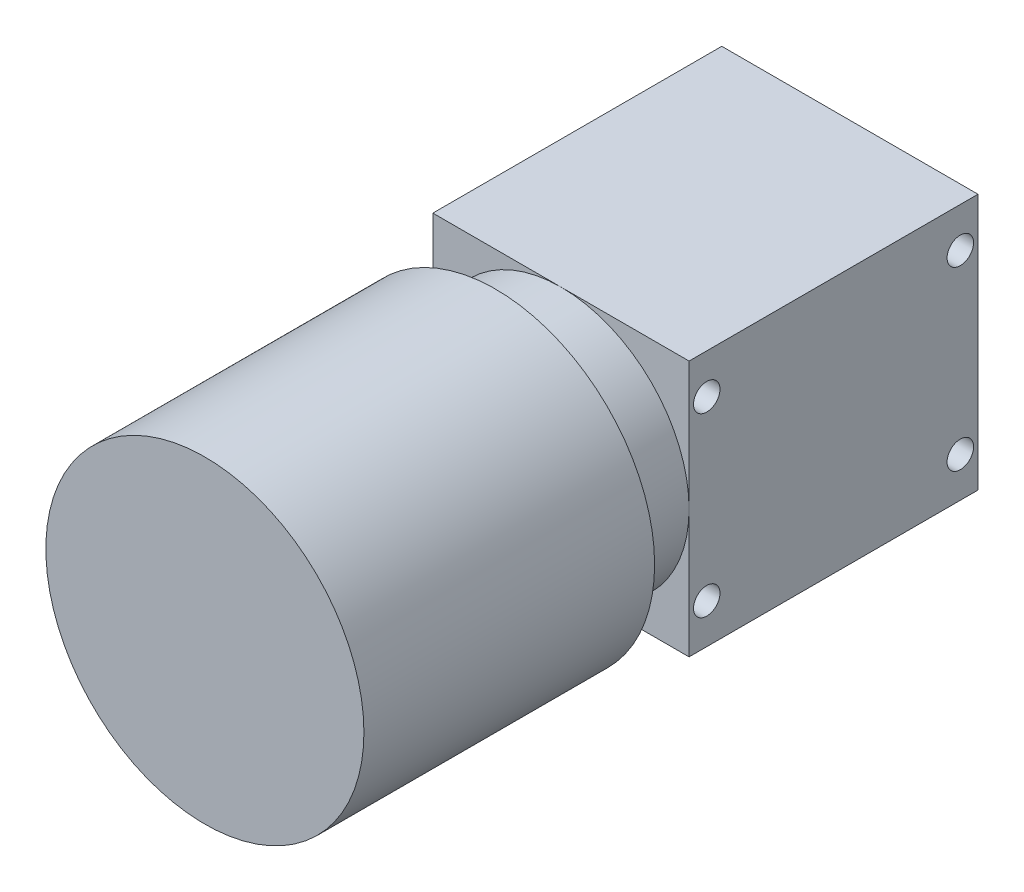
ISO-10303-21;
HEADER;
FILE_DESCRIPTION(('STEP AP214'),'2;1');
FILE_NAME('part.step','',(''),(''),'','','');
FILE_SCHEMA(('AUTOMOTIVE_DESIGN { 1 0 10303 214 1 1 1 1 }'));
ENDSEC;
DATA;
#1=APPLICATION_CONTEXT('core data for automotive mechanical design processes');
#2=APPLICATION_PROTOCOL_DEFINITION('international standard','automotive_design',2000,#1);
#3=PRODUCT_CONTEXT('',#1,'mechanical');
#4=PRODUCT('Part','Part','',(#3));
#5=PRODUCT_RELATED_PRODUCT_CATEGORY('part','',(#4));
#6=PRODUCT_DEFINITION_FORMATION('','',#4);
#7=PRODUCT_DEFINITION_CONTEXT('part definition',#1,'design');
#8=PRODUCT_DEFINITION('design','',#6,#7);
#9=PRODUCT_DEFINITION_SHAPE('','',#8);
#10=(LENGTH_UNIT() NAMED_UNIT(*) SI_UNIT(.MILLI.,.METRE.));
#11=(NAMED_UNIT(*) PLANE_ANGLE_UNIT() SI_UNIT($,.RADIAN.));
#12=(NAMED_UNIT(*) SI_UNIT($,.STERADIAN.) SOLID_ANGLE_UNIT());
#13=UNCERTAINTY_MEASURE_WITH_UNIT(LENGTH_MEASURE(1.E-05),#10,'distance_accuracy_value','');
#14=(GEOMETRIC_REPRESENTATION_CONTEXT(3) GLOBAL_UNCERTAINTY_ASSIGNED_CONTEXT((#13)) GLOBAL_UNIT_ASSIGNED_CONTEXT((#10,
#11,#12)) REPRESENTATION_CONTEXT('',''));
#15=CARTESIAN_POINT('',(0.,0.,0.));
#16=DIRECTION('',(0.,0.,1.));
#17=DIRECTION('',(1.,0.,0.));
#18=AXIS2_PLACEMENT_3D('',#15,#16,#17);
#19=CARTESIAN_POINT('',(0.,0.,32.7));
#20=DIRECTION('',(0.,0.,-1.));
#21=DIRECTION('',(-1.,0.,0.));
#22=AXIS2_PLACEMENT_3D('',#19,#20,#21);
#23=PLANE('',#22);
#24=CARTESIAN_POINT('',(0.,0.,32.7));
#25=DIRECTION('',(0.,0.,1.));
#26=DIRECTION('',(1.,0.,0.));
#27=AXIS2_PLACEMENT_3D('',#24,#25,#26);
#28=CIRCLE('',#27,14.5);
#29=CARTESIAN_POINT('',(14.5,0.,32.7));
#30=VERTEX_POINT('',#29);
#31=CARTESIAN_POINT('',(0.,14.5,32.7));
#32=VERTEX_POINT('',#31);
#33=EDGE_CURVE('E243',#30,#32,#28,.T.);
#34=ORIENTED_EDGE('',*,*,#33,.F.);
#35=DIRECTION('',(0.,1.,0.));
#36=VECTOR('',#35,1.);
#37=CARTESIAN_POINT('',(14.5,-14.5,32.7));
#38=LINE('',#37,#36);
#39=CARTESIAN_POINT('',(14.5,14.5,32.7));
#40=VERTEX_POINT('',#39);
#41=EDGE_CURVE('E294',#30,#40,#38,.T.);
#42=ORIENTED_EDGE('',*,*,#41,.T.);
#43=DIRECTION('',(-1.,0.,0.));
#44=VECTOR('',#43,1.);
#45=CARTESIAN_POINT('',(-14.5,14.5,32.7));
#46=LINE('',#45,#44);
#47=EDGE_CURVE('E305',#40,#32,#46,.T.);
#48=ORIENTED_EDGE('',*,*,#47,.T.);
#49=EDGE_LOOP('',(#34,#42,#48));
#50=FACE_BOUND('',#49,.T.);
#51=ADVANCED_FACE('F231',(#50),#23,.F.);
#52=CARTESIAN_POINT('',(-14.5,0.,32.7));
#53=VERTEX_POINT('',#52);
#54=EDGE_CURVE('E192',#32,#53,#28,.T.);
#55=ORIENTED_EDGE('',*,*,#54,.F.);
#56=CARTESIAN_POINT('',(-14.5,14.5,32.7));
#57=VERTEX_POINT('',#56);
#58=EDGE_CURVE('E293',#32,#57,#46,.T.);
#59=ORIENTED_EDGE('',*,*,#58,.T.);
#60=DIRECTION('',(0.,-1.,0.));
#61=VECTOR('',#60,1.);
#62=CARTESIAN_POINT('',(-14.5,-14.5,32.7));
#63=LINE('',#62,#61);
#64=EDGE_CURVE('E316',#57,#53,#63,.T.);
#65=ORIENTED_EDGE('',*,*,#64,.T.);
#66=EDGE_LOOP('',(#55,#59,#65));
#67=FACE_BOUND('',#66,.T.);
#68=ADVANCED_FACE('F349',(#67),#23,.F.);
#69=CARTESIAN_POINT('',(0.,-14.5,32.7));
#70=VERTEX_POINT('',#69);
#71=EDGE_CURVE('E241',#53,#70,#28,.T.);
#72=ORIENTED_EDGE('',*,*,#71,.F.);
#73=CARTESIAN_POINT('',(-14.5,-14.5,32.7));
#74=VERTEX_POINT('',#73);
#75=EDGE_CURVE('E315',#53,#74,#63,.T.);
#76=ORIENTED_EDGE('',*,*,#75,.T.);
#77=DIRECTION('',(1.,0.,0.));
#78=VECTOR('',#77,1.);
#79=CARTESIAN_POINT('',(-14.5,-14.5,32.7));
#80=LINE('',#79,#78);
#81=EDGE_CURVE('E319',#74,#70,#80,.T.);
#82=ORIENTED_EDGE('',*,*,#81,.T.);
#83=EDGE_LOOP('',(#72,#76,#82));
#84=FACE_BOUND('',#83,.T.);
#85=ADVANCED_FACE('F358',(#84),#23,.F.);
#86=CARTESIAN_POINT('',(14.5,-14.5,32.7));
#87=DIRECTION('',(-1.,0.,0.));
#88=DIRECTION('',(0.,0.,1.));
#89=AXIS2_PLACEMENT_3D('',#86,#87,#88);
#90=PLANE('',#89);
#91=CARTESIAN_POINT('',(14.5,10.,1.99999999999999));
#92=DIRECTION('',(-1.,0.,0.));
#93=DIRECTION('',(0.,0.,1.));
#94=AXIS2_PLACEMENT_3D('',#91,#92,#93);
#95=CIRCLE('',#94,1.5);
#96=CARTESIAN_POINT('',(14.5,10.,3.49999999999999));
#97=VERTEX_POINT('',#96);
#98=EDGE_CURVE('E553',#97,#97,#95,.T.);
#99=ORIENTED_EDGE('',*,*,#98,.T.);
#100=EDGE_LOOP('',(#99));
#101=FACE_BOUND('',#100,.T.);
#102=CARTESIAN_POINT('',(14.5,-10.,30.7));
#103=DIRECTION('',(-1.,0.,0.));
#104=DIRECTION('',(0.,0.,1.));
#105=AXIS2_PLACEMENT_3D('',#102,#103,#104);
#106=CIRCLE('',#105,1.5);
#107=CARTESIAN_POINT('',(14.5,-10.,32.2));
#108=VERTEX_POINT('',#107);
#109=EDGE_CURVE('E545',#108,#108,#106,.T.);
#110=ORIENTED_EDGE('',*,*,#109,.T.);
#111=EDGE_LOOP('',(#110));
#112=FACE_BOUND('',#111,.T.);
#113=CARTESIAN_POINT('',(14.5,-10.,1.99999999999999));
#114=DIRECTION('',(-1.,0.,0.));
#115=DIRECTION('',(0.,0.,1.));
#116=AXIS2_PLACEMENT_3D('',#113,#114,#115);
#117=CIRCLE('',#116,1.5);
#118=CARTESIAN_POINT('',(14.5,-10.,3.49999999999999));
#119=VERTEX_POINT('',#118);
#120=EDGE_CURVE('E542',#119,#119,#117,.T.);
#121=ORIENTED_EDGE('',*,*,#120,.T.);
#122=EDGE_LOOP('',(#121));
#123=FACE_BOUND('',#122,.T.);
#124=CARTESIAN_POINT('',(14.5,10.,30.7));
#125=DIRECTION('',(-1.,0.,0.));
#126=DIRECTION('',(0.,0.,1.));
#127=AXIS2_PLACEMENT_3D('',#124,#125,#126);
#128=CIRCLE('',#127,1.5);
#129=CARTESIAN_POINT('',(14.5,10.,32.2));
#130=VERTEX_POINT('',#129);
#131=EDGE_CURVE('E540',#130,#130,#128,.T.);
#132=ORIENTED_EDGE('',*,*,#131,.T.);
#133=EDGE_LOOP('',(#132));
#134=FACE_BOUND('',#133,.T.);
#135=DIRECTION('',(0.,1.,0.));
#136=VECTOR('',#135,1.);
#137=CARTESIAN_POINT('',(14.5,-14.5,0.));
#138=LINE('',#137,#136);
#139=CARTESIAN_POINT('',(14.5,-14.5,0.));
#140=VERTEX_POINT('',#139);
#141=CARTESIAN_POINT('',(14.5,14.5,0.));
#142=VERTEX_POINT('',#141);
#143=EDGE_CURVE('E322',#140,#142,#138,.T.);
#144=ORIENTED_EDGE('',*,*,#143,.T.);
#145=DIRECTION('',(0.,0.,-1.));
#146=VECTOR('',#145,1.);
#147=CARTESIAN_POINT('',(14.5,14.5,32.7));
#148=LINE('',#147,#146);
#149=EDGE_CURVE('E235',#40,#142,#148,.T.);
#150=ORIENTED_EDGE('',*,*,#149,.F.);
#151=ORIENTED_EDGE('',*,*,#41,.F.);
#152=CARTESIAN_POINT('',(14.5,-14.5,32.7));
#153=VERTEX_POINT('',#152);
#154=EDGE_CURVE('E286',#153,#30,#38,.T.);
#155=ORIENTED_EDGE('',*,*,#154,.F.);
#156=DIRECTION('',(0.,0.,-1.));
#157=VECTOR('',#156,1.);
#158=CARTESIAN_POINT('',(14.5,-14.5,32.7));
#159=LINE('',#158,#157);
#160=EDGE_CURVE('E321',#153,#140,#159,.T.);
#161=ORIENTED_EDGE('',*,*,#160,.T.);
#162=EDGE_LOOP('',(#144,#150,#151,#155,#161));
#163=FACE_BOUND('',#162,.T.);
#164=ADVANCED_FACE('F233',(#101,#112,#123,#134,#163),#90,.F.);
#165=CARTESIAN_POINT('',(-14.5,14.5,32.7));
#166=DIRECTION('',(0.,-1.,0.));
#167=DIRECTION('',(0.,0.,-1.));
#168=AXIS2_PLACEMENT_3D('',#165,#166,#167);
#169=PLANE('',#168);
#170=DIRECTION('',(-1.,0.,0.));
#171=VECTOR('',#170,1.);
#172=CARTESIAN_POINT('',(-14.5,14.5,0.));
#173=LINE('',#172,#171);
#174=CARTESIAN_POINT('',(-14.5,14.5,0.));
#175=VERTEX_POINT('',#174);
#176=EDGE_CURVE('E324',#142,#175,#173,.T.);
#177=ORIENTED_EDGE('',*,*,#176,.T.);
#178=DIRECTION('',(0.,0.,-1.));
#179=VECTOR('',#178,1.);
#180=CARTESIAN_POINT('',(-14.5,14.5,32.7));
#181=LINE('',#180,#179);
#182=EDGE_CURVE('E310',#57,#175,#181,.T.);
#183=ORIENTED_EDGE('',*,*,#182,.F.);
#184=ORIENTED_EDGE('',*,*,#58,.F.);
#185=ORIENTED_EDGE('',*,*,#47,.F.);
#186=ORIENTED_EDGE('',*,*,#149,.T.);
#187=EDGE_LOOP('',(#177,#183,#184,#185,#186));
#188=FACE_BOUND('',#187,.T.);
#189=ADVANCED_FACE('F350',(#188),#169,.F.);
#190=CARTESIAN_POINT('',(-14.5,-14.5,32.7));
#191=DIRECTION('',(1.,0.,0.));
#192=DIRECTION('',(0.,1.,0.));
#193=AXIS2_PLACEMENT_3D('',#190,#191,#192);
#194=PLANE('',#193);
#195=CARTESIAN_POINT('',(-14.5,10.,1.99999999999999));
#196=DIRECTION('',(-1.,0.,0.));
#197=DIRECTION('',(0.,-1.,0.));
#198=AXIS2_PLACEMENT_3D('',#195,#196,#197);
#199=CIRCLE('',#198,1.5);
#200=CARTESIAN_POINT('',(-14.5,8.5,1.99999999999999));
#201=VERTEX_POINT('',#200);
#202=EDGE_CURVE('E547',#201,#201,#199,.T.);
#203=ORIENTED_EDGE('',*,*,#202,.F.);
#204=EDGE_LOOP('',(#203));
#205=FACE_BOUND('',#204,.T.);
#206=CARTESIAN_POINT('',(-14.5,-10.,30.7));
#207=DIRECTION('',(-1.,0.,0.));
#208=DIRECTION('',(0.,-1.,0.));
#209=AXIS2_PLACEMENT_3D('',#206,#207,#208);
#210=CIRCLE('',#209,1.5);
#211=CARTESIAN_POINT('',(-14.5,-11.5,30.7));
#212=VERTEX_POINT('',#211);
#213=EDGE_CURVE('E564',#212,#212,#210,.T.);
#214=ORIENTED_EDGE('',*,*,#213,.F.);
#215=EDGE_LOOP('',(#214));
#216=FACE_BOUND('',#215,.T.);
#217=CARTESIAN_POINT('',(-14.5,-10.,1.99999999999999));
#218=DIRECTION('',(-1.,0.,0.));
#219=DIRECTION('',(0.,-1.,0.));
#220=AXIS2_PLACEMENT_3D('',#217,#218,#219);
#221=CIRCLE('',#220,1.5);
#222=CARTESIAN_POINT('',(-14.5,-11.5,1.99999999999999));
#223=VERTEX_POINT('',#222);
#224=EDGE_CURVE('E558',#223,#223,#221,.T.);
#225=ORIENTED_EDGE('',*,*,#224,.F.);
#226=EDGE_LOOP('',(#225));
#227=FACE_BOUND('',#226,.T.);
#228=CARTESIAN_POINT('',(-14.5,10.,30.7));
#229=DIRECTION('',(-1.,0.,0.));
#230=DIRECTION('',(0.,-1.,0.));
#231=AXIS2_PLACEMENT_3D('',#228,#229,#230);
#232=CIRCLE('',#231,1.5);
#233=CARTESIAN_POINT('',(-14.5,8.5,30.7));
#234=VERTEX_POINT('',#233);
#235=EDGE_CURVE('E537',#234,#234,#232,.T.);
#236=ORIENTED_EDGE('',*,*,#235,.F.);
#237=EDGE_LOOP('',(#236));
#238=FACE_BOUND('',#237,.T.);
#239=DIRECTION('',(0.,-1.,0.));
#240=VECTOR('',#239,1.);
#241=CARTESIAN_POINT('',(-14.5,-14.5,0.));
#242=LINE('',#241,#240);
#243=CARTESIAN_POINT('',(-14.5,-14.5,0.));
#244=VERTEX_POINT('',#243);
#245=EDGE_CURVE('E326',#175,#244,#242,.T.);
#246=ORIENTED_EDGE('',*,*,#245,.T.);
#247=DIRECTION('',(0.,0.,-1.));
#248=VECTOR('',#247,1.);
#249=CARTESIAN_POINT('',(-14.5,-14.5,32.7));
#250=LINE('',#249,#248);
#251=EDGE_CURVE('E330',#74,#244,#250,.T.);
#252=ORIENTED_EDGE('',*,*,#251,.F.);
#253=ORIENTED_EDGE('',*,*,#75,.F.);
#254=ORIENTED_EDGE('',*,*,#64,.F.);
#255=ORIENTED_EDGE('',*,*,#182,.T.);
#256=EDGE_LOOP('',(#246,#252,#253,#254,#255));
#257=FACE_BOUND('',#256,.T.);
#258=ADVANCED_FACE('F337',(#205,#216,#227,#238,#257),#194,.F.);
#259=CARTESIAN_POINT('',(-14.5,-14.5,32.7));
#260=DIRECTION('',(0.,1.,0.));
#261=DIRECTION('',(0.,0.,1.));
#262=AXIS2_PLACEMENT_3D('',#259,#260,#261);
#263=PLANE('',#262);
#264=DIRECTION('',(1.,0.,0.));
#265=VECTOR('',#264,1.);
#266=CARTESIAN_POINT('',(-14.5,-14.5,0.));
#267=LINE('',#266,#265);
#268=EDGE_CURVE('E303',#244,#140,#267,.T.);
#269=ORIENTED_EDGE('',*,*,#268,.T.);
#270=ORIENTED_EDGE('',*,*,#160,.F.);
#271=EDGE_CURVE('E289',#70,#153,#80,.T.);
#272=ORIENTED_EDGE('',*,*,#271,.F.);
#273=ORIENTED_EDGE('',*,*,#81,.F.);
#274=ORIENTED_EDGE('',*,*,#251,.T.);
#275=EDGE_LOOP('',(#269,#270,#272,#273,#274));
#276=FACE_BOUND('',#275,.T.);
#277=ADVANCED_FACE('F346',(#276),#263,.F.);
#278=EDGE_CURVE('E250',#70,#30,#28,.T.);
#279=ORIENTED_EDGE('',*,*,#278,.F.);
#280=ORIENTED_EDGE('',*,*,#271,.T.);
#281=ORIENTED_EDGE('',*,*,#154,.T.);
#282=EDGE_LOOP('',(#279,#280,#281));
#283=FACE_BOUND('',#282,.T.);
#284=ADVANCED_FACE('F288',(#283),#23,.F.);
#285=CARTESIAN_POINT('',(0.,0.,0.));
#286=DIRECTION('',(0.,0.,-1.));
#287=DIRECTION('',(-1.,0.,0.));
#288=AXIS2_PLACEMENT_3D('',#285,#286,#287);
#289=PLANE('',#288);
#290=ORIENTED_EDGE('',*,*,#143,.F.);
#291=ORIENTED_EDGE('',*,*,#268,.F.);
#292=ORIENTED_EDGE('',*,*,#245,.F.);
#293=ORIENTED_EDGE('',*,*,#176,.F.);
#294=EDGE_LOOP('',(#290,#291,#292,#293));
#295=FACE_BOUND('',#294,.T.);
#296=ADVANCED_FACE('F344',(#295),#289,.T.);
#297=CARTESIAN_POINT('',(0.,0.,40.1));
#298=DIRECTION('',(0.,0.,-1.));
#299=DIRECTION('',(-1.,0.,0.));
#300=AXIS2_PLACEMENT_3D('',#297,#298,#299);
#301=CYLINDRICAL_SURFACE('',#300,14.5);
#302=CARTESIAN_POINT('',(0.,0.,40.1));
#303=DIRECTION('',(0.,0.,1.));
#304=DIRECTION('',(1.,0.,0.));
#305=AXIS2_PLACEMENT_3D('',#302,#303,#304);
#306=CIRCLE('',#305,14.5);
#307=CARTESIAN_POINT('',(14.5,0.,40.1));
#308=VERTEX_POINT('',#307);
#309=EDGE_CURVE('E307',#308,#308,#306,.T.);
#310=ORIENTED_EDGE('',*,*,#309,.F.);
#311=EDGE_LOOP('',(#310));
#312=FACE_BOUND('',#311,.T.);
#313=ORIENTED_EDGE('',*,*,#33,.T.);
#314=ORIENTED_EDGE('',*,*,#54,.T.);
#315=ORIENTED_EDGE('',*,*,#71,.T.);
#316=ORIENTED_EDGE('',*,*,#278,.T.);
#317=EDGE_LOOP('',(#313,#314,#315,#316));
#318=FACE_BOUND('',#317,.T.);
#319=ADVANCED_FACE('F309',(#312,#318),#301,.T.);
#320=CARTESIAN_POINT('',(27.9,10.,30.7));
#321=DIRECTION('',(-1.,0.,0.));
#322=DIRECTION('',(0.,-1.,0.));
#323=AXIS2_PLACEMENT_3D('',#320,#321,#322);
#324=CYLINDRICAL_SURFACE('',#323,1.5);
#325=ORIENTED_EDGE('',*,*,#235,.T.);
#326=EDGE_LOOP('',(#325));
#327=FACE_BOUND('',#326,.T.);
#328=ORIENTED_EDGE('',*,*,#131,.F.);
#329=EDGE_LOOP('',(#328));
#330=FACE_BOUND('',#329,.T.);
#331=ADVANCED_FACE('F433',(#327,#330),#324,.F.);
#332=CARTESIAN_POINT('',(27.9,-10.,1.99999999999999));
#333=DIRECTION('',(-1.,0.,0.));
#334=DIRECTION('',(0.,-1.,0.));
#335=AXIS2_PLACEMENT_3D('',#332,#333,#334);
#336=CYLINDRICAL_SURFACE('',#335,1.5);
#337=ORIENTED_EDGE('',*,*,#224,.T.);
#338=EDGE_LOOP('',(#337));
#339=FACE_BOUND('',#338,.T.);
#340=ORIENTED_EDGE('',*,*,#120,.F.);
#341=EDGE_LOOP('',(#340));
#342=FACE_BOUND('',#341,.T.);
#343=ADVANCED_FACE('F514',(#339,#342),#336,.F.);
#344=CARTESIAN_POINT('',(27.9,-10.,30.7));
#345=DIRECTION('',(-1.,0.,0.));
#346=DIRECTION('',(0.,-1.,0.));
#347=AXIS2_PLACEMENT_3D('',#344,#345,#346);
#348=CYLINDRICAL_SURFACE('',#347,1.5);
#349=ORIENTED_EDGE('',*,*,#213,.T.);
#350=EDGE_LOOP('',(#349));
#351=FACE_BOUND('',#350,.T.);
#352=ORIENTED_EDGE('',*,*,#109,.F.);
#353=EDGE_LOOP('',(#352));
#354=FACE_BOUND('',#353,.T.);
#355=ADVANCED_FACE('F504',(#351,#354),#348,.F.);
#356=CARTESIAN_POINT('',(27.9,10.,1.99999999999999));
#357=DIRECTION('',(-1.,0.,0.));
#358=DIRECTION('',(0.,-1.,0.));
#359=AXIS2_PLACEMENT_3D('',#356,#357,#358);
#360=CYLINDRICAL_SURFACE('',#359,1.5);
#361=ORIENTED_EDGE('',*,*,#202,.T.);
#362=EDGE_LOOP('',(#361));
#363=FACE_BOUND('',#362,.T.);
#364=ORIENTED_EDGE('',*,*,#98,.F.);
#365=EDGE_LOOP('',(#364));
#366=FACE_BOUND('',#365,.T.);
#367=ADVANCED_FACE('F494',(#363,#366),#360,.F.);
#368=CARTESIAN_POINT('',(0.,0.,73.));
#369=DIRECTION('',(0.,0.,-1.));
#370=DIRECTION('',(-1.,0.,0.));
#371=AXIS2_PLACEMENT_3D('',#368,#369,#370);
#372=CYLINDRICAL_SURFACE('',#371,18.);
#373=CARTESIAN_POINT('',(0.,0.,73.));
#374=DIRECTION('',(0.,0.,1.));
#375=DIRECTION('',(1.,0.,0.));
#376=AXIS2_PLACEMENT_3D('',#373,#374,#375);
#377=CIRCLE('',#376,18.);
#378=CARTESIAN_POINT('',(18.,0.,73.));
#379=VERTEX_POINT('',#378);
#380=EDGE_CURVE('E559',#379,#379,#377,.T.);
#381=ORIENTED_EDGE('',*,*,#380,.F.);
#382=EDGE_LOOP('',(#381));
#383=FACE_BOUND('',#382,.T.);
#384=CARTESIAN_POINT('',(0.,0.,40.1));
#385=DIRECTION('',(0.,0.,1.));
#386=DIRECTION('',(1.,0.,0.));
#387=AXIS2_PLACEMENT_3D('',#384,#385,#386);
#388=CIRCLE('',#387,18.);
#389=CARTESIAN_POINT('',(18.,0.,40.1));
#390=VERTEX_POINT('',#389);
#391=EDGE_CURVE('E567',#390,#390,#388,.T.);
#392=ORIENTED_EDGE('',*,*,#391,.T.);
#393=EDGE_LOOP('',(#392));
#394=FACE_BOUND('',#393,.T.);
#395=ADVANCED_FACE('F484',(#383,#394),#372,.T.);
#396=CARTESIAN_POINT('',(0.,0.,73.));
#397=DIRECTION('',(0.,0.,1.));
#398=DIRECTION('',(1.,0.,0.));
#399=AXIS2_PLACEMENT_3D('',#396,#397,#398);
#400=PLANE('',#399);
#401=ORIENTED_EDGE('',*,*,#380,.T.);
#402=EDGE_LOOP('',(#401));
#403=FACE_BOUND('',#402,.T.);
#404=ADVANCED_FACE('F475',(#403),#400,.T.);
#405=CARTESIAN_POINT('',(0.,0.,40.1));
#406=DIRECTION('',(0.,0.,1.));
#407=DIRECTION('',(1.,0.,0.));
#408=AXIS2_PLACEMENT_3D('',#405,#406,#407);
#409=PLANE('',#408);
#410=ORIENTED_EDGE('',*,*,#309,.T.);
#411=EDGE_LOOP('',(#410));
#412=FACE_BOUND('',#411,.T.);
#413=ORIENTED_EDGE('',*,*,#391,.F.);
#414=EDGE_LOOP('',(#413));
#415=FACE_BOUND('',#414,.T.);
#416=ADVANCED_FACE('F466',(#412,#415),#409,.F.);
#417=CLOSED_SHELL('',(#51,#68,#85,#164,#189,#258,#277,#284,#296,#319,#331,#343,#355,#367,#395,
#404,#416));
#418=CARTESIAN_POINT('',(0.,0.,32.7));
#419=DIRECTION('',(0.,0.,1.));
#420=DIRECTION('',(1.,0.,0.));
#421=AXIS2_PLACEMENT_3D('',#418,#419,#420);
#422=CIRCLE('',#421,12.9958677685952);
#423=CARTESIAN_POINT('',(12.9958677685952,0.,32.7));
#424=VERTEX_POINT('',#423);
#425=EDGE_CURVE('E308',#424,#424,#422,.T.);
#426=ORIENTED_EDGE('',*,*,#425,.T.);
#427=EDGE_LOOP('',(#426));
#428=FACE_BOUND('',#427,.T.);
#429=ADVANCED_FACE('F368',(#428),#23,.F.);
#430=CARTESIAN_POINT('',(0.,0.,40.1));
#431=DIRECTION('',(0.,0.,-1.));
#432=DIRECTION('',(-1.,0.,0.));
#433=AXIS2_PLACEMENT_3D('',#430,#431,#432);
#434=CYLINDRICAL_SURFACE('',#433,12.9958677685952);
#435=CARTESIAN_POINT('',(0.,0.,40.1));
#436=DIRECTION('',(0.,0.,1.));
#437=DIRECTION('',(1.,0.,0.));
#438=AXIS2_PLACEMENT_3D('',#435,#436,#437);
#439=CIRCLE('',#438,12.9958677685952);
#440=CARTESIAN_POINT('',(12.9958677685952,0.,40.1));
#441=VERTEX_POINT('',#440);
#442=EDGE_CURVE('E556',#441,#441,#439,.T.);
#443=ORIENTED_EDGE('',*,*,#442,.T.);
#444=EDGE_LOOP('',(#443));
#445=FACE_BOUND('',#444,.T.);
#446=ORIENTED_EDGE('',*,*,#425,.F.);
#447=EDGE_LOOP('',(#446));
#448=FACE_BOUND('',#447,.T.);
#449=ADVANCED_FACE('F375',(#445,#448),#434,.F.);
#450=ORIENTED_EDGE('',*,*,#442,.F.);
#451=EDGE_LOOP('',(#450));
#452=FACE_BOUND('',#451,.T.);
#453=ADVANCED_FACE('F382',(#452),#409,.F.);
#454=CLOSED_SHELL('',(#429,#449,#453));
#455=ORIENTED_CLOSED_SHELL('',*,#454,.T.);
#456=BREP_WITH_VOIDS('B141',#417,(#455));
#457=ADVANCED_BREP_SHAPE_REPRESENTATION('',(#18,#456),#14);
#458=SHAPE_DEFINITION_REPRESENTATION(#9,#457);
ENDSEC;
END-ISO-10303-21;
